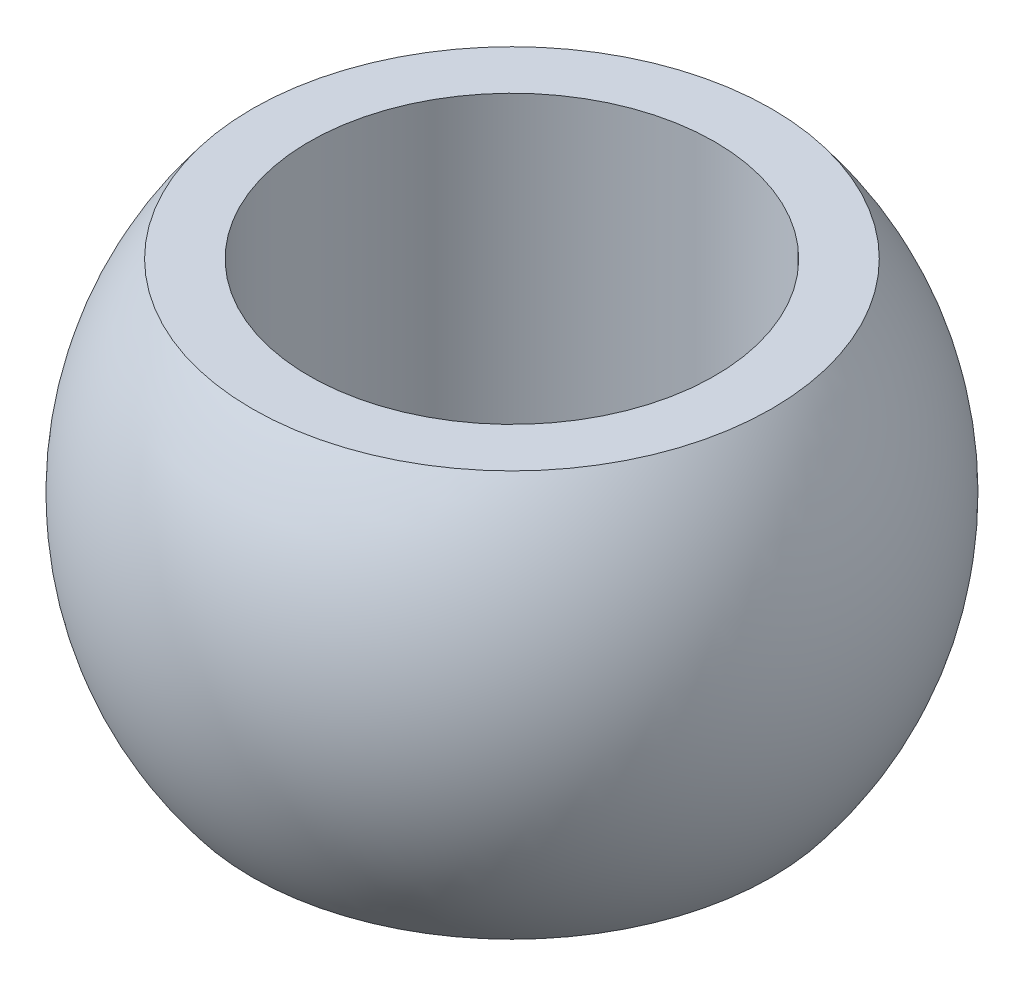
ISO-10303-21;
HEADER;
FILE_DESCRIPTION(('STEP AP214'),'2;1');
FILE_NAME('part.step','',(''),(''),'','','');
FILE_SCHEMA(('AUTOMOTIVE_DESIGN { 1 0 10303 214 1 1 1 1 }'));
ENDSEC;
DATA;
#1=APPLICATION_CONTEXT('core data for automotive mechanical design processes');
#2=APPLICATION_PROTOCOL_DEFINITION('international standard','automotive_design',2000,#1);
#3=PRODUCT_CONTEXT('',#1,'mechanical');
#4=PRODUCT('Part','Part','',(#3));
#5=PRODUCT_RELATED_PRODUCT_CATEGORY('part','',(#4));
#6=PRODUCT_DEFINITION_FORMATION('','',#4);
#7=PRODUCT_DEFINITION_CONTEXT('part definition',#1,'design');
#8=PRODUCT_DEFINITION('design','',#6,#7);
#9=PRODUCT_DEFINITION_SHAPE('','',#8);
#10=(LENGTH_UNIT() NAMED_UNIT(*) SI_UNIT(.MILLI.,.METRE.));
#11=(NAMED_UNIT(*) PLANE_ANGLE_UNIT() SI_UNIT($,.RADIAN.));
#12=(NAMED_UNIT(*) SI_UNIT($,.STERADIAN.) SOLID_ANGLE_UNIT());
#13=UNCERTAINTY_MEASURE_WITH_UNIT(LENGTH_MEASURE(1.E-05),#10,'distance_accuracy_value','');
#14=(GEOMETRIC_REPRESENTATION_CONTEXT(3) GLOBAL_UNCERTAINTY_ASSIGNED_CONTEXT((#13)) GLOBAL_UNIT_ASSIGNED_CONTEXT((#10,
#11,#12)) REPRESENTATION_CONTEXT('',''));
#15=CARTESIAN_POINT('',(0.,0.,0.));
#16=DIRECTION('',(0.,0.,1.));
#17=DIRECTION('',(1.,0.,0.));
#18=AXIS2_PLACEMENT_3D('',#15,#16,#17);
#19=CARTESIAN_POINT('',(0.,0.,0.));
#20=DIRECTION('',(0.,-1.,0.));
#21=DIRECTION('',(-1.,0.,0.));
#22=AXIS2_PLACEMENT_3D('',#19,#20,#21);
#23=SPHERICAL_SURFACE('',#22,6.5);
#24=CARTESIAN_POINT('',(0.,-4.,0.));
#25=DIRECTION('',(0.,-1.,0.));
#26=DIRECTION('',(0.,0.,-1.));
#27=AXIS2_PLACEMENT_3D('',#24,#25,#26);
#28=CIRCLE('',#27,5.1234753829798);
#29=CARTESIAN_POINT('',(-5.1234753829798,-4.,0.));
#30=VERTEX_POINT('',#29);
#31=EDGE_CURVE('E10',#30,#30,#28,.T.);
#32=CARTESIAN_POINT('',(0.,4.,0.));
#33=DIRECTION('',(0.,-1.,0.));
#34=DIRECTION('',(0.,0.,-1.));
#35=AXIS2_PLACEMENT_3D('',#32,#33,#34);
#36=CIRCLE('',#35,5.1234753829798);
#37=CARTESIAN_POINT('',(-5.1234753829798,4.,0.));
#38=VERTEX_POINT('',#37);
#39=EDGE_CURVE('E42',#38,#38,#36,.T.);
#40=CARTESIAN_POINT('',(-5.1234753829798,-4.,0.));
#41=CARTESIAN_POINT('',(-5.17871579924343,-3.92924613267691,0.));
#42=CARTESIAN_POINT('',(-5.23248872526666,-3.85734667060042,0.));
#43=CARTESIAN_POINT('',(-5.33701140534739,-3.71138287860066,0.));
#44=CARTESIAN_POINT('',(-5.38776115940489,-3.63731854867739,0.));
#45=CARTESIAN_POINT('',(-5.48614930406928,-3.48715134264412,0.));
#46=CARTESIAN_POINT('',(-5.53378769467617,-3.41104846653411,0.));
#47=CARTESIAN_POINT('',(-5.62587165076756,-3.25693498377907,0.));
#48=CARTESIAN_POINT('',(-5.67031721625206,-3.17892437713404,0.));
#49=CARTESIAN_POINT('',(-5.75593916734842,-3.02112925620086,0.));
#50=CARTESIAN_POINT('',(-5.79711555296028,-2.94134474191271,0.));
#51=CARTESIAN_POINT('',(-5.8761284998324,-2.78013874438176,0.));
#52=CARTESIAN_POINT('',(-5.91396506109267,-2.69871726113897,0.));
#53=CARTESIAN_POINT('',(-5.98623341973607,-2.53437705454858,0.));
#54=CARTESIAN_POINT('',(-6.02066521711919,-2.45145833120099,0.));
#55=CARTESIAN_POINT('',(-6.08606495879372,-2.28426594789715,0.));
#56=CARTESIAN_POINT('',(-6.11703290308513,-2.19999228794091,0.));
#57=CARTESIAN_POINT('',(-6.1754517919933,-2.03023465883897,0.));
#58=CARTESIAN_POINT('',(-6.20290273661008,-1.94475068969328,0.));
#59=CARTESIAN_POINT('',(-6.25424051586086,-1.77271914709327,0.));
#60=CARTESIAN_POINT('',(-6.27812735049487,-1.68617157363897,0.));
#61=CARTESIAN_POINT('',(-6.32229591594357,-1.51216135252692,0.));
#62=CARTESIAN_POINT('',(-6.34257764675826,-1.42469870486918,0.));
#63=CARTESIAN_POINT('',(-6.37950119773043,-1.24900843590244,0.));
#64=CARTESIAN_POINT('',(-6.39614301788792,-1.16078081459344,0.));
#65=CARTESIAN_POINT('',(-6.42575818739399,-0.983712011692116,0.));
#66=CARTESIAN_POINT('',(-6.43873153674258,-0.894870830099793,0.));
#67=CARTESIAN_POINT('',(-6.4609875001919,-0.716727372973835,0.));
#68=CARTESIAN_POINT('',(-6.47027011429264,-0.6274250974402,0.));
#69=CARTESIAN_POINT('',(-6.4851286767262,-0.448512710087521,0.));
#70=CARTESIAN_POINT('',(-6.49070462505902,-0.358902598268477,0.));
#71=CARTESIAN_POINT('',(-6.49814028669592,-0.179528324299622,0.));
#72=CARTESIAN_POINT('',(-6.5,-0.0897641621498107,0.));
#73=CARTESIAN_POINT('',(-6.5,0.0897641621498121,0.));
#74=CARTESIAN_POINT('',(-6.49814028669592,0.179528324299623,0.));
#75=CARTESIAN_POINT('',(-6.49070462505902,0.358902598268479,0.));
#76=CARTESIAN_POINT('',(-6.4851286767262,0.448512710087523,0.));
#77=CARTESIAN_POINT('',(-6.47027011429264,0.627425097440202,0.));
#78=CARTESIAN_POINT('',(-6.4609875001919,0.716727372973836,0.));
#79=CARTESIAN_POINT('',(-6.43873153674258,0.894870830099794,0.));
#80=CARTESIAN_POINT('',(-6.42575818739399,0.983712011692117,0.));
#81=CARTESIAN_POINT('',(-6.39614301788792,1.16078081459344,0.));
#82=CARTESIAN_POINT('',(-6.37950119773043,1.24900843590244,0.));
#83=CARTESIAN_POINT('',(-6.34257764675826,1.42469870486918,0.));
#84=CARTESIAN_POINT('',(-6.32229591594357,1.51216135252692,0.));
#85=CARTESIAN_POINT('',(-6.27812735049487,1.68617157363897,0.));
#86=CARTESIAN_POINT('',(-6.25424051586086,1.77271914709328,0.));
#87=CARTESIAN_POINT('',(-6.20290273661008,1.94475068969328,0.));
#88=CARTESIAN_POINT('',(-6.1754517919933,2.03023465883897,0.));
#89=CARTESIAN_POINT('',(-6.11703290308513,2.19999228794091,0.));
#90=CARTESIAN_POINT('',(-6.08606495879372,2.28426594789715,0.));
#91=CARTESIAN_POINT('',(-6.02066521711919,2.45145833120099,0.));
#92=CARTESIAN_POINT('',(-5.98623341973607,2.53437705454858,0.));
#93=CARTESIAN_POINT('',(-5.91396506109267,2.69871726113897,0.));
#94=CARTESIAN_POINT('',(-5.8761284998324,2.78013874438176,0.));
#95=CARTESIAN_POINT('',(-5.79711555296028,2.94134474191271,0.));
#96=CARTESIAN_POINT('',(-5.75593916734842,3.02112925620086,0.));
#97=CARTESIAN_POINT('',(-5.67031721625206,3.17892437713404,0.));
#98=CARTESIAN_POINT('',(-5.62587165076756,3.25693498377907,0.));
#99=CARTESIAN_POINT('',(-5.53378769467617,3.41104846653411,0.));
#100=CARTESIAN_POINT('',(-5.48614930406928,3.48715134264412,0.));
#101=CARTESIAN_POINT('',(-5.38776115940489,3.63731854867739,0.));
#102=CARTESIAN_POINT('',(-5.33701140534739,3.71138287860066,0.));
#103=CARTESIAN_POINT('',(-5.23248872526666,3.85734667060042,0.));
#104=CARTESIAN_POINT('',(-5.17871579924343,3.92924613267692,0.));
#105=CARTESIAN_POINT('',(-5.1234753829798,4.,0.));
#106=B_SPLINE_CURVE_WITH_KNOTS('',3,(#40,#41,#42,#43,#44,#45,#46,#47,#48,#49,#50,#51,#52,#53,
#54,#55,#56,#57,#58,#59,#60,#61,#62,#63,#64,#65,#66,#67,#68,#69,#70,#71,#72,#73,#74,#75,#76,#77,
#78,#79,#80,#81,#82,#83,#84,#85,#86,#87,#88,#89,#90,#91,#92,#93,#94,#95,#96,#97,#98,#99,#100,
#101,#102,#103,#104,#105),.UNSPECIFIED.,.F.,.F.,(4,2,2,2,2,2,2,2,2,2,2,2,2,2,2,2,2,2,2,2,2,2,2,
2,2,2,2,2,2,2,2,2,4),(0.,0.269273232224858,0.538546464449717,0.807819696674576,1.07709292889944,
1.34636616112429,1.61563939334915,1.88491262557401,2.15418585779887,2.42345909002373,
2.69273232224859,2.96200555447345,3.23127878669831,3.50055201892316,3.76982525114802,
4.03909848337288,4.30837171559774,4.5776449478226,4.84691818004746,5.11619141227232,
5.38546464449718,5.65473787672203,5.92401110894689,6.19328434117175,6.46255757339661,
6.73183080562147,7.00110403784633,7.27037727007119,7.53965050229605,7.8089237345209,
8.07819696674576,8.34747019897062,8.61674343119548),.UNSPECIFIED.);
#107=EDGE_CURVE('BSEAM28',#30,#38,#106,.T.);
#108=ORIENTED_EDGE('',*,*,#31,.F.);
#109=ORIENTED_EDGE('',*,*,#39,.T.);
#110=ORIENTED_EDGE('',*,*,#107,.T.);
#111=ORIENTED_EDGE('',*,*,#107,.F.);
#112=EDGE_LOOP('',(#108,#110,#109,#111));
#113=FACE_BOUND('',#112,.T.);
#114=ADVANCED_FACE('F28',(#113),#23,.T.);
#115=CARTESIAN_POINT('',(-5.1234753829798,-4.,0.));
#116=DIRECTION('',(0.,1.,0.));
#117=DIRECTION('',(0.,0.,1.));
#118=AXIS2_PLACEMENT_3D('',#115,#116,#117);
#119=PLANE('',#118);
#120=CARTESIAN_POINT('',(0.,-4.,0.));
#121=DIRECTION('',(0.,-1.,0.));
#122=DIRECTION('',(0.,0.,-1.));
#123=AXIS2_PLACEMENT_3D('',#120,#121,#122);
#124=CIRCLE('',#123,4.);
#125=CARTESIAN_POINT('',(0.,-4.,-4.));
#126=VERTEX_POINT('',#125);
#127=EDGE_CURVE('E34',#126,#126,#124,.T.);
#128=ORIENTED_EDGE('',*,*,#127,.F.);
#129=EDGE_LOOP('',(#128));
#130=FACE_BOUND('',#129,.T.);
#131=ORIENTED_EDGE('',*,*,#31,.T.);
#132=EDGE_LOOP('',(#131));
#133=FACE_BOUND('',#132,.T.);
#134=ADVANCED_FACE('F57',(#130,#133),#119,.F.);
#135=CARTESIAN_POINT('',(0.,-18.2176876042246,0.));
#136=DIRECTION('',(0.,-1.,0.));
#137=DIRECTION('',(0.,0.,-1.));
#138=AXIS2_PLACEMENT_3D('',#135,#136,#137);
#139=CYLINDRICAL_SURFACE('',#138,4.);
#140=CARTESIAN_POINT('',(0.,4.,0.));
#141=DIRECTION('',(0.,-1.,0.));
#142=DIRECTION('',(0.,0.,-1.));
#143=AXIS2_PLACEMENT_3D('',#140,#141,#142);
#144=CIRCLE('',#143,4.);
#145=CARTESIAN_POINT('',(0.,4.,-4.));
#146=VERTEX_POINT('',#145);
#147=EDGE_CURVE('E38',#146,#146,#144,.T.);
#148=ORIENTED_EDGE('',*,*,#147,.F.);
#149=EDGE_LOOP('',(#148));
#150=FACE_BOUND('',#149,.T.);
#151=ORIENTED_EDGE('',*,*,#127,.T.);
#152=EDGE_LOOP('',(#151));
#153=FACE_BOUND('',#152,.T.);
#154=ADVANCED_FACE('F52',(#150,#153),#139,.F.);
#155=CARTESIAN_POINT('',(-5.1234753829798,4.,0.));
#156=DIRECTION('',(0.,-1.,0.));
#157=DIRECTION('',(0.,0.,-1.));
#158=AXIS2_PLACEMENT_3D('',#155,#156,#157);
#159=PLANE('',#158);
#160=ORIENTED_EDGE('',*,*,#39,.F.);
#161=EDGE_LOOP('',(#160));
#162=FACE_BOUND('',#161,.T.);
#163=ORIENTED_EDGE('',*,*,#147,.T.);
#164=EDGE_LOOP('',(#163));
#165=FACE_BOUND('',#164,.T.);
#166=ADVANCED_FACE('F49',(#162,#165),#159,.F.);
#167=CLOSED_SHELL('',(#114,#134,#154,#166));
#168=MANIFOLD_SOLID_BREP('B2',#167);
#169=ADVANCED_BREP_SHAPE_REPRESENTATION('',(#18,#168),#14);
#170=SHAPE_DEFINITION_REPRESENTATION(#9,#169);
ENDSEC;
END-ISO-10303-21;
